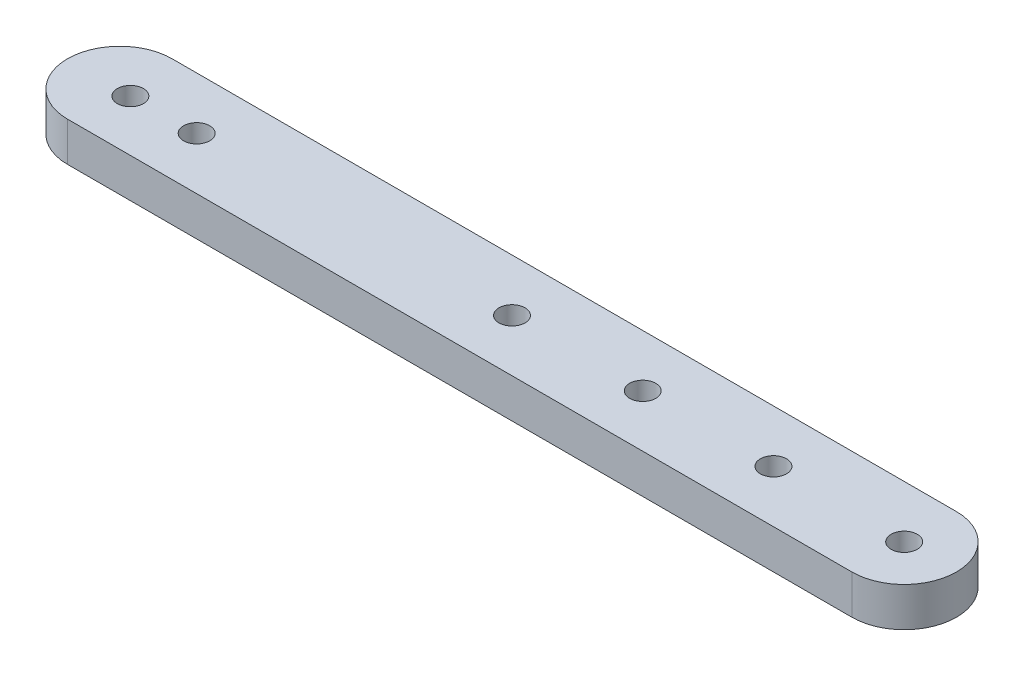
ISO-10303-21;
HEADER;
FILE_DESCRIPTION(('STEP AP214'),'2;1');
FILE_NAME('part.step','',(''),(''),'','','');
FILE_SCHEMA(('AUTOMOTIVE_DESIGN { 1 0 10303 214 1 1 1 1 }'));
ENDSEC;
DATA;
#1=APPLICATION_CONTEXT('core data for automotive mechanical design processes');
#2=APPLICATION_PROTOCOL_DEFINITION('international standard','automotive_design',2000,#1);
#3=PRODUCT_CONTEXT('',#1,'mechanical');
#4=PRODUCT('Part','Part','',(#3));
#5=PRODUCT_RELATED_PRODUCT_CATEGORY('part','',(#4));
#6=PRODUCT_DEFINITION_FORMATION('','',#4);
#7=PRODUCT_DEFINITION_CONTEXT('part definition',#1,'design');
#8=PRODUCT_DEFINITION('design','',#6,#7);
#9=PRODUCT_DEFINITION_SHAPE('','',#8);
#10=(LENGTH_UNIT() NAMED_UNIT(*) SI_UNIT(.MILLI.,.METRE.));
#11=(NAMED_UNIT(*) PLANE_ANGLE_UNIT() SI_UNIT($,.RADIAN.));
#12=(NAMED_UNIT(*) SI_UNIT($,.STERADIAN.) SOLID_ANGLE_UNIT());
#13=UNCERTAINTY_MEASURE_WITH_UNIT(LENGTH_MEASURE(1.E-05),#10,'distance_accuracy_value','');
#14=(GEOMETRIC_REPRESENTATION_CONTEXT(3) GLOBAL_UNCERTAINTY_ASSIGNED_CONTEXT((#13)) GLOBAL_UNIT_ASSIGNED_CONTEXT((#10,
#11,#12)) REPRESENTATION_CONTEXT('',''));
#15=CARTESIAN_POINT('',(0.,0.,0.));
#16=DIRECTION('',(0.,0.,1.));
#17=DIRECTION('',(1.,0.,0.));
#18=AXIS2_PLACEMENT_3D('',#15,#16,#17);
#19=CARTESIAN_POINT('',(60.,6.,0.));
#20=DIRECTION('',(0.,1.,0.));
#21=DIRECTION('',(0.,0.,1.));
#22=AXIS2_PLACEMENT_3D('',#19,#20,#21);
#23=PLANE('',#22);
#24=CARTESIAN_POINT('',(40.,6.,0.));
#25=DIRECTION('',(0.,1.,0.));
#26=DIRECTION('',(0.,0.,1.));
#27=AXIS2_PLACEMENT_3D('',#24,#25,#26);
#28=CIRCLE('',#27,2.);
#29=CARTESIAN_POINT('',(40.,6.,2.));
#30=VERTEX_POINT('',#29);
#31=EDGE_CURVE('E158',#30,#30,#28,.T.);
#32=ORIENTED_EDGE('',*,*,#31,.F.);
#33=EDGE_LOOP('',(#32));
#34=FACE_BOUND('',#33,.T.);
#35=CARTESIAN_POINT('',(20.,6.,0.));
#36=DIRECTION('',(0.,1.,0.));
#37=DIRECTION('',(0.,0.,1.));
#38=AXIS2_PLACEMENT_3D('',#35,#36,#37);
#39=CIRCLE('',#38,2.);
#40=CARTESIAN_POINT('',(20.,6.,2.));
#41=VERTEX_POINT('',#40);
#42=EDGE_CURVE('E142',#41,#41,#39,.T.);
#43=ORIENTED_EDGE('',*,*,#42,.F.);
#44=EDGE_LOOP('',(#43));
#45=FACE_BOUND('',#44,.T.);
#46=CARTESIAN_POINT('',(-58.2457988045519,6.,0.14103811714419));
#47=DIRECTION('',(0.,1.,0.));
#48=DIRECTION('',(0.,0.,1.));
#49=AXIS2_PLACEMENT_3D('',#46,#47,#48);
#50=CIRCLE('',#49,2.);
#51=CARTESIAN_POINT('',(-58.2457988045519,6.,2.14103811714419));
#52=VERTEX_POINT('',#51);
#53=EDGE_CURVE('E112',#52,#52,#50,.T.);
#54=ORIENTED_EDGE('',*,*,#53,.F.);
#55=EDGE_LOOP('',(#54));
#56=FACE_BOUND('',#55,.T.);
#57=CARTESIAN_POINT('',(60.,6.,0.));
#58=DIRECTION('',(0.,1.,0.));
#59=DIRECTION('',(0.,0.,1.));
#60=AXIS2_PLACEMENT_3D('',#57,#58,#59);
#61=CIRCLE('',#60,8.);
#62=CARTESIAN_POINT('',(60.,6.,8.));
#63=VERTEX_POINT('',#62);
#64=CARTESIAN_POINT('',(60.,6.,-8.));
#65=VERTEX_POINT('',#64);
#66=EDGE_CURVE('E92',#63,#65,#61,.T.);
#67=ORIENTED_EDGE('',*,*,#66,.T.);
#68=DIRECTION('',(-1.,0.,0.));
#69=VECTOR('',#68,1.);
#70=CARTESIAN_POINT('',(-60.,6.,-8.));
#71=LINE('',#70,#69);
#72=CARTESIAN_POINT('',(-60.,6.,-8.));
#73=VERTEX_POINT('',#72);
#74=EDGE_CURVE('E87',#65,#73,#71,.T.);
#75=ORIENTED_EDGE('',*,*,#74,.T.);
#76=CARTESIAN_POINT('',(-60.,6.,0.));
#77=DIRECTION('',(0.,1.,0.));
#78=DIRECTION('',(0.,0.,1.));
#79=AXIS2_PLACEMENT_3D('',#76,#77,#78);
#80=CIRCLE('',#79,8.);
#81=CARTESIAN_POINT('',(-60.,6.,8.));
#82=VERTEX_POINT('',#81);
#83=EDGE_CURVE('E90',#73,#82,#80,.T.);
#84=ORIENTED_EDGE('',*,*,#83,.T.);
#85=DIRECTION('',(1.,0.,0.));
#86=VECTOR('',#85,1.);
#87=CARTESIAN_POINT('',(-60.,6.,8.));
#88=LINE('',#87,#86);
#89=EDGE_CURVE('E57',#82,#63,#88,.T.);
#90=ORIENTED_EDGE('',*,*,#89,.T.);
#91=EDGE_LOOP('',(#67,#75,#84,#90));
#92=FACE_BOUND('',#91,.T.);
#93=CARTESIAN_POINT('',(60.,6.,0.));
#94=DIRECTION('',(0.,1.,0.));
#95=DIRECTION('',(0.,0.,1.));
#96=AXIS2_PLACEMENT_3D('',#93,#94,#95);
#97=CIRCLE('',#96,2.);
#98=CARTESIAN_POINT('',(60.,6.,2.));
#99=VERTEX_POINT('',#98);
#100=EDGE_CURVE('E134',#99,#99,#97,.T.);
#101=ORIENTED_EDGE('',*,*,#100,.F.);
#102=EDGE_LOOP('',(#101));
#103=FACE_BOUND('',#102,.T.);
#104=CARTESIAN_POINT('',(-48.2457988045519,6.,0.));
#105=DIRECTION('',(0.,1.,0.));
#106=DIRECTION('',(0.,0.,1.));
#107=AXIS2_PLACEMENT_3D('',#104,#105,#106);
#108=CIRCLE('',#107,2.);
#109=CARTESIAN_POINT('',(-48.2457988045519,6.,2.));
#110=VERTEX_POINT('',#109);
#111=EDGE_CURVE('E150',#110,#110,#108,.T.);
#112=ORIENTED_EDGE('',*,*,#111,.F.);
#113=EDGE_LOOP('',(#112));
#114=FACE_BOUND('',#113,.T.);
#115=CARTESIAN_POINT('',(0.,6.,0.));
#116=DIRECTION('',(0.,1.,0.));
#117=DIRECTION('',(0.,0.,1.));
#118=AXIS2_PLACEMENT_3D('',#115,#116,#117);
#119=CIRCLE('',#118,2.);
#120=CARTESIAN_POINT('',(0.,6.,2.));
#121=VERTEX_POINT('',#120);
#122=EDGE_CURVE('E166',#121,#121,#119,.T.);
#123=ORIENTED_EDGE('',*,*,#122,.F.);
#124=EDGE_LOOP('',(#123));
#125=FACE_BOUND('',#124,.T.);
#126=ADVANCED_FACE('F39',(#34,#45,#56,#92,#103,#114,#125),#23,.T.);
#127=CARTESIAN_POINT('',(60.,0.,0.));
#128=DIRECTION('',(0.,1.,0.));
#129=DIRECTION('',(0.,0.,1.));
#130=AXIS2_PLACEMENT_3D('',#127,#128,#129);
#131=PLANE('',#130);
#132=CARTESIAN_POINT('',(60.,0.,0.));
#133=DIRECTION('',(0.,1.,0.));
#134=DIRECTION('',(0.,0.,1.));
#135=AXIS2_PLACEMENT_3D('',#132,#133,#134);
#136=CIRCLE('',#135,8.);
#137=CARTESIAN_POINT('',(60.,0.,8.));
#138=VERTEX_POINT('',#137);
#139=CARTESIAN_POINT('',(60.,0.,-8.));
#140=VERTEX_POINT('',#139);
#141=EDGE_CURVE('E108',#138,#140,#136,.T.);
#142=ORIENTED_EDGE('',*,*,#141,.F.);
#143=DIRECTION('',(1.,0.,0.));
#144=VECTOR('',#143,1.);
#145=CARTESIAN_POINT('',(-60.,0.,8.));
#146=LINE('',#145,#144);
#147=CARTESIAN_POINT('',(-60.,0.,8.));
#148=VERTEX_POINT('',#147);
#149=EDGE_CURVE('E80',#148,#138,#146,.T.);
#150=ORIENTED_EDGE('',*,*,#149,.F.);
#151=CARTESIAN_POINT('',(-60.,0.,0.));
#152=DIRECTION('',(0.,1.,0.));
#153=DIRECTION('',(0.,0.,1.));
#154=AXIS2_PLACEMENT_3D('',#151,#152,#153);
#155=CIRCLE('',#154,8.);
#156=CARTESIAN_POINT('',(-60.,0.,-8.));
#157=VERTEX_POINT('',#156);
#158=EDGE_CURVE('E74',#157,#148,#155,.T.);
#159=ORIENTED_EDGE('',*,*,#158,.F.);
#160=DIRECTION('',(-1.,0.,0.));
#161=VECTOR('',#160,1.);
#162=CARTESIAN_POINT('',(-60.,0.,-8.));
#163=LINE('',#162,#161);
#164=EDGE_CURVE('E97',#140,#157,#163,.T.);
#165=ORIENTED_EDGE('',*,*,#164,.F.);
#166=EDGE_LOOP('',(#142,#150,#159,#165));
#167=FACE_BOUND('',#166,.T.);
#168=CARTESIAN_POINT('',(-58.2457988045519,0.,0.14103811714419));
#169=DIRECTION('',(0.,1.,0.));
#170=DIRECTION('',(0.,0.,1.));
#171=AXIS2_PLACEMENT_3D('',#168,#169,#170);
#172=CIRCLE('',#171,2.);
#173=CARTESIAN_POINT('',(-58.2457988045519,0.,2.14103811714419));
#174=VERTEX_POINT('',#173);
#175=EDGE_CURVE('E130',#174,#174,#172,.T.);
#176=ORIENTED_EDGE('',*,*,#175,.T.);
#177=EDGE_LOOP('',(#176));
#178=FACE_BOUND('',#177,.T.);
#179=CARTESIAN_POINT('',(60.,0.,0.));
#180=DIRECTION('',(0.,1.,0.));
#181=DIRECTION('',(0.,0.,1.));
#182=AXIS2_PLACEMENT_3D('',#179,#180,#181);
#183=CIRCLE('',#182,2.);
#184=CARTESIAN_POINT('',(60.,0.,2.));
#185=VERTEX_POINT('',#184);
#186=EDGE_CURVE('E138',#185,#185,#183,.T.);
#187=ORIENTED_EDGE('',*,*,#186,.T.);
#188=EDGE_LOOP('',(#187));
#189=FACE_BOUND('',#188,.T.);
#190=CARTESIAN_POINT('',(20.,0.,0.));
#191=DIRECTION('',(0.,1.,0.));
#192=DIRECTION('',(0.,0.,1.));
#193=AXIS2_PLACEMENT_3D('',#190,#191,#192);
#194=CIRCLE('',#193,2.);
#195=CARTESIAN_POINT('',(20.,0.,2.));
#196=VERTEX_POINT('',#195);
#197=EDGE_CURVE('E146',#196,#196,#194,.T.);
#198=ORIENTED_EDGE('',*,*,#197,.T.);
#199=EDGE_LOOP('',(#198));
#200=FACE_BOUND('',#199,.T.);
#201=CARTESIAN_POINT('',(-48.2457988045519,0.,0.));
#202=DIRECTION('',(0.,1.,0.));
#203=DIRECTION('',(0.,0.,1.));
#204=AXIS2_PLACEMENT_3D('',#201,#202,#203);
#205=CIRCLE('',#204,2.);
#206=CARTESIAN_POINT('',(-48.2457988045519,0.,2.));
#207=VERTEX_POINT('',#206);
#208=EDGE_CURVE('E154',#207,#207,#205,.T.);
#209=ORIENTED_EDGE('',*,*,#208,.T.);
#210=EDGE_LOOP('',(#209));
#211=FACE_BOUND('',#210,.T.);
#212=CARTESIAN_POINT('',(40.,0.,0.));
#213=DIRECTION('',(0.,1.,0.));
#214=DIRECTION('',(0.,0.,1.));
#215=AXIS2_PLACEMENT_3D('',#212,#213,#214);
#216=CIRCLE('',#215,2.);
#217=CARTESIAN_POINT('',(40.,0.,2.));
#218=VERTEX_POINT('',#217);
#219=EDGE_CURVE('E162',#218,#218,#216,.T.);
#220=ORIENTED_EDGE('',*,*,#219,.T.);
#221=EDGE_LOOP('',(#220));
#222=FACE_BOUND('',#221,.T.);
#223=CARTESIAN_POINT('',(0.,0.,0.));
#224=DIRECTION('',(0.,1.,0.));
#225=DIRECTION('',(0.,0.,1.));
#226=AXIS2_PLACEMENT_3D('',#223,#224,#225);
#227=CIRCLE('',#226,2.);
#228=CARTESIAN_POINT('',(0.,0.,2.));
#229=VERTEX_POINT('',#228);
#230=EDGE_CURVE('E170',#229,#229,#227,.T.);
#231=ORIENTED_EDGE('',*,*,#230,.T.);
#232=EDGE_LOOP('',(#231));
#233=FACE_BOUND('',#232,.T.);
#234=ADVANCED_FACE('F125',(#167,#178,#189,#200,#211,#222,#233),#131,.F.);
#235=CARTESIAN_POINT('',(60.,6.,0.));
#236=DIRECTION('',(0.,-1.,0.));
#237=DIRECTION('',(0.,0.,-1.));
#238=AXIS2_PLACEMENT_3D('',#235,#236,#237);
#239=CYLINDRICAL_SURFACE('',#238,8.);
#240=ORIENTED_EDGE('',*,*,#141,.T.);
#241=DIRECTION('',(0.,-1.,0.));
#242=VECTOR('',#241,1.);
#243=CARTESIAN_POINT('',(60.,6.,-8.));
#244=LINE('',#243,#242);
#245=EDGE_CURVE('E11',#65,#140,#244,.T.);
#246=ORIENTED_EDGE('',*,*,#245,.F.);
#247=ORIENTED_EDGE('',*,*,#66,.F.);
#248=DIRECTION('',(0.,-1.,0.));
#249=VECTOR('',#248,1.);
#250=CARTESIAN_POINT('',(60.,6.,8.));
#251=LINE('',#250,#249);
#252=EDGE_CURVE('E104',#63,#138,#251,.T.);
#253=ORIENTED_EDGE('',*,*,#252,.T.);
#254=EDGE_LOOP('',(#240,#246,#247,#253));
#255=FACE_BOUND('',#254,.T.);
#256=ADVANCED_FACE('F41',(#255),#239,.T.);
#257=CARTESIAN_POINT('',(-60.,6.,-8.));
#258=DIRECTION('',(0.,0.,1.));
#259=DIRECTION('',(1.,0.,0.));
#260=AXIS2_PLACEMENT_3D('',#257,#258,#259);
#261=PLANE('',#260);
#262=ORIENTED_EDGE('',*,*,#164,.T.);
#263=DIRECTION('',(0.,-1.,0.));
#264=VECTOR('',#263,1.);
#265=CARTESIAN_POINT('',(-60.,6.,-8.));
#266=LINE('',#265,#264);
#267=EDGE_CURVE('E49',#73,#157,#266,.T.);
#268=ORIENTED_EDGE('',*,*,#267,.F.);
#269=ORIENTED_EDGE('',*,*,#74,.F.);
#270=ORIENTED_EDGE('',*,*,#245,.T.);
#271=EDGE_LOOP('',(#262,#268,#269,#270));
#272=FACE_BOUND('',#271,.T.);
#273=ADVANCED_FACE('F96',(#272),#261,.F.);
#274=CARTESIAN_POINT('',(-60.,6.,0.));
#275=DIRECTION('',(0.,-1.,0.));
#276=DIRECTION('',(0.,0.,-1.));
#277=AXIS2_PLACEMENT_3D('',#274,#275,#276);
#278=CYLINDRICAL_SURFACE('',#277,8.);
#279=ORIENTED_EDGE('',*,*,#158,.T.);
#280=DIRECTION('',(0.,-1.,0.));
#281=VECTOR('',#280,1.);
#282=CARTESIAN_POINT('',(-60.,6.,8.));
#283=LINE('',#282,#281);
#284=EDGE_CURVE('E99',#82,#148,#283,.T.);
#285=ORIENTED_EDGE('',*,*,#284,.F.);
#286=ORIENTED_EDGE('',*,*,#83,.F.);
#287=ORIENTED_EDGE('',*,*,#267,.T.);
#288=EDGE_LOOP('',(#279,#285,#286,#287));
#289=FACE_BOUND('',#288,.T.);
#290=ADVANCED_FACE('F100',(#289),#278,.T.);
#291=CARTESIAN_POINT('',(-60.,6.,8.));
#292=DIRECTION('',(0.,0.,-1.));
#293=DIRECTION('',(-1.,0.,0.));
#294=AXIS2_PLACEMENT_3D('',#291,#292,#293);
#295=PLANE('',#294);
#296=ORIENTED_EDGE('',*,*,#149,.T.);
#297=ORIENTED_EDGE('',*,*,#252,.F.);
#298=ORIENTED_EDGE('',*,*,#89,.F.);
#299=ORIENTED_EDGE('',*,*,#284,.T.);
#300=EDGE_LOOP('',(#296,#297,#298,#299));
#301=FACE_BOUND('',#300,.T.);
#302=ADVANCED_FACE('F122',(#301),#295,.F.);
#303=CARTESIAN_POINT('',(-58.2457988045519,6.,0.14103811714419));
#304=DIRECTION('',(0.,-1.,0.));
#305=DIRECTION('',(0.,0.,-1.));
#306=AXIS2_PLACEMENT_3D('',#303,#304,#305);
#307=CYLINDRICAL_SURFACE('',#306,2.);
#308=ORIENTED_EDGE('',*,*,#53,.T.);
#309=EDGE_LOOP('',(#308));
#310=FACE_BOUND('',#309,.T.);
#311=ORIENTED_EDGE('',*,*,#175,.F.);
#312=EDGE_LOOP('',(#311));
#313=FACE_BOUND('',#312,.T.);
#314=ADVANCED_FACE('F191',(#310,#313),#307,.F.);
#315=CARTESIAN_POINT('',(60.,6.,0.));
#316=DIRECTION('',(0.,-1.,0.));
#317=DIRECTION('',(0.,0.,-1.));
#318=AXIS2_PLACEMENT_3D('',#315,#316,#317);
#319=CYLINDRICAL_SURFACE('',#318,2.);
#320=ORIENTED_EDGE('',*,*,#100,.T.);
#321=EDGE_LOOP('',(#320));
#322=FACE_BOUND('',#321,.T.);
#323=ORIENTED_EDGE('',*,*,#186,.F.);
#324=EDGE_LOOP('',(#323));
#325=FACE_BOUND('',#324,.T.);
#326=ADVANCED_FACE('F237',(#322,#325),#319,.F.);
#327=CARTESIAN_POINT('',(20.,6.,0.));
#328=DIRECTION('',(0.,-1.,0.));
#329=DIRECTION('',(0.,0.,-1.));
#330=AXIS2_PLACEMENT_3D('',#327,#328,#329);
#331=CYLINDRICAL_SURFACE('',#330,2.);
#332=ORIENTED_EDGE('',*,*,#42,.T.);
#333=EDGE_LOOP('',(#332));
#334=FACE_BOUND('',#333,.T.);
#335=ORIENTED_EDGE('',*,*,#197,.F.);
#336=EDGE_LOOP('',(#335));
#337=FACE_BOUND('',#336,.T.);
#338=ADVANCED_FACE('F245',(#334,#337),#331,.F.);
#339=CARTESIAN_POINT('',(-48.2457988045519,6.,0.));
#340=DIRECTION('',(0.,-1.,0.));
#341=DIRECTION('',(0.,0.,-1.));
#342=AXIS2_PLACEMENT_3D('',#339,#340,#341);
#343=CYLINDRICAL_SURFACE('',#342,2.);
#344=ORIENTED_EDGE('',*,*,#111,.T.);
#345=EDGE_LOOP('',(#344));
#346=FACE_BOUND('',#345,.T.);
#347=ORIENTED_EDGE('',*,*,#208,.F.);
#348=EDGE_LOOP('',(#347));
#349=FACE_BOUND('',#348,.T.);
#350=ADVANCED_FACE('F253',(#346,#349),#343,.F.);
#351=CARTESIAN_POINT('',(40.,6.,0.));
#352=DIRECTION('',(0.,-1.,0.));
#353=DIRECTION('',(0.,0.,-1.));
#354=AXIS2_PLACEMENT_3D('',#351,#352,#353);
#355=CYLINDRICAL_SURFACE('',#354,2.);
#356=ORIENTED_EDGE('',*,*,#31,.T.);
#357=EDGE_LOOP('',(#356));
#358=FACE_BOUND('',#357,.T.);
#359=ORIENTED_EDGE('',*,*,#219,.F.);
#360=EDGE_LOOP('',(#359));
#361=FACE_BOUND('',#360,.T.);
#362=ADVANCED_FACE('F262',(#358,#361),#355,.F.);
#363=CARTESIAN_POINT('',(0.,6.,0.));
#364=DIRECTION('',(0.,-1.,0.));
#365=DIRECTION('',(0.,0.,-1.));
#366=AXIS2_PLACEMENT_3D('',#363,#364,#365);
#367=CYLINDRICAL_SURFACE('',#366,2.);
#368=ORIENTED_EDGE('',*,*,#122,.T.);
#369=EDGE_LOOP('',(#368));
#370=FACE_BOUND('',#369,.T.);
#371=ORIENTED_EDGE('',*,*,#230,.F.);
#372=EDGE_LOOP('',(#371));
#373=FACE_BOUND('',#372,.T.);
#374=ADVANCED_FACE('F178',(#370,#373),#367,.F.);
#375=CLOSED_SHELL('',(#126,#234,#256,#273,#290,#302,#314,#326,#338,#350,#362,#374));
#376=MANIFOLD_SOLID_BREP('B2',#375);
#377=ADVANCED_BREP_SHAPE_REPRESENTATION('',(#18,#376),#14);
#378=SHAPE_DEFINITION_REPRESENTATION(#9,#377);
ENDSEC;
END-ISO-10303-21;
